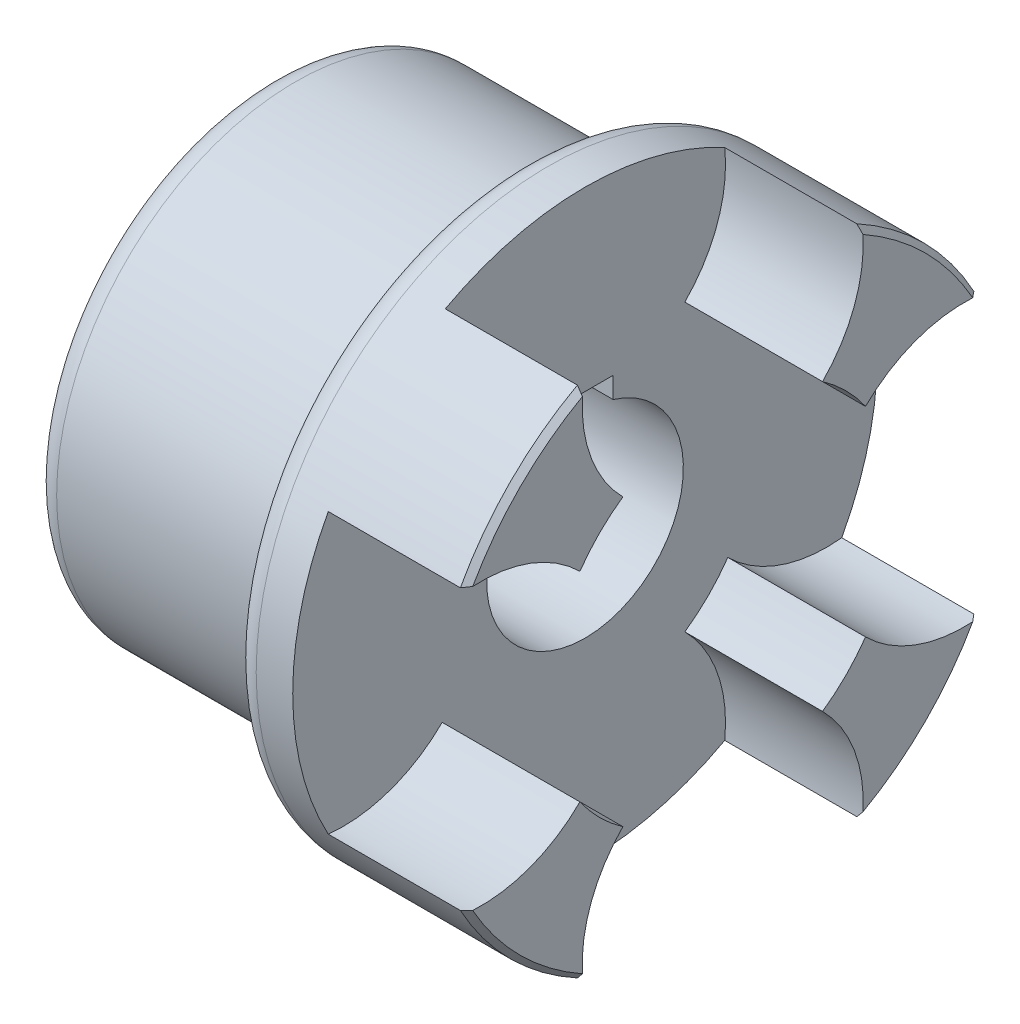
ISO-10303-21;
HEADER;
FILE_DESCRIPTION(('STEP AP214'),'2;1');
FILE_NAME('part.step','',(''),(''),'','','');
FILE_SCHEMA(('AUTOMOTIVE_DESIGN { 1 0 10303 214 1 1 1 1 }'));
ENDSEC;
DATA;
#1=APPLICATION_CONTEXT('core data for automotive mechanical design processes');
#2=APPLICATION_PROTOCOL_DEFINITION('international standard','automotive_design',2000,#1);
#3=PRODUCT_CONTEXT('',#1,'mechanical');
#4=PRODUCT('Part','Part','',(#3));
#5=PRODUCT_RELATED_PRODUCT_CATEGORY('part','',(#4));
#6=PRODUCT_DEFINITION_FORMATION('','',#4);
#7=PRODUCT_DEFINITION_CONTEXT('part definition',#1,'design');
#8=PRODUCT_DEFINITION('design','',#6,#7);
#9=PRODUCT_DEFINITION_SHAPE('','',#8);
#10=(LENGTH_UNIT() NAMED_UNIT(*) SI_UNIT(.MILLI.,.METRE.));
#11=(NAMED_UNIT(*) PLANE_ANGLE_UNIT() SI_UNIT($,.RADIAN.));
#12=(NAMED_UNIT(*) SI_UNIT($,.STERADIAN.) SOLID_ANGLE_UNIT());
#13=UNCERTAINTY_MEASURE_WITH_UNIT(LENGTH_MEASURE(1.E-05),#10,'distance_accuracy_value','');
#14=(GEOMETRIC_REPRESENTATION_CONTEXT(3) GLOBAL_UNCERTAINTY_ASSIGNED_CONTEXT((#13)) GLOBAL_UNIT_ASSIGNED_CONTEXT((#10,
#11,#12)) REPRESENTATION_CONTEXT('',''));
#15=CARTESIAN_POINT('',(0.,0.,0.));
#16=DIRECTION('',(0.,0.,1.));
#17=DIRECTION('',(1.,0.,0.));
#18=AXIS2_PLACEMENT_3D('',#15,#16,#17);
#19=CARTESIAN_POINT('',(-70.2450877192982,-25.1421929824561,0.));
#20=DIRECTION('',(-1.,0.,0.));
#21=DIRECTION('',(0.,0.,1.));
#22=AXIS2_PLACEMENT_3D('',#19,#20,#21);
#23=CYLINDRICAL_SURFACE('',#22,17.5);
#24=CARTESIAN_POINT('',(-14.2450877192987,-25.1421929824561,0.));
#25=DIRECTION('',(1.,0.,0.));
#26=DIRECTION('',(0.,0.,-1.));
#27=AXIS2_PLACEMENT_3D('',#24,#25,#26);
#28=CIRCLE('',#27,17.5);
#29=CARTESIAN_POINT('',(-14.2450877192987,-8.37168315120772,-5.));
#30=VERTEX_POINT('',#29);
#31=CARTESIAN_POINT('',(-14.2450877192987,-8.37168315120772,5.));
#32=VERTEX_POINT('',#31);
#33=EDGE_CURVE('E320',#30,#32,#28,.F.);
#34=ORIENTED_EDGE('',*,*,#33,.F.);
#35=DIRECTION('',(-1.,0.,0.));
#36=VECTOR('',#35,1.);
#37=CARTESIAN_POINT('',(-70.2450877192982,-8.37168315120772,-5.));
#38=LINE('',#37,#36);
#39=CARTESIAN_POINT('',(-69.2450877192982,-8.37168315120772,-5.));
#40=VERTEX_POINT('',#39);
#41=EDGE_CURVE('E264',#30,#40,#38,.T.);
#42=ORIENTED_EDGE('',*,*,#41,.T.);
#43=CARTESIAN_POINT('',(-69.2450877192982,-25.1421929824561,0.));
#44=DIRECTION('',(-1.,0.,0.));
#45=DIRECTION('',(0.,0.,1.));
#46=AXIS2_PLACEMENT_3D('',#43,#44,#45);
#47=CIRCLE('',#46,17.5);
#48=CARTESIAN_POINT('',(-69.2450877192982,-8.37168315120772,5.));
#49=VERTEX_POINT('',#48);
#50=EDGE_CURVE('E550',#40,#49,#47,.T.);
#51=ORIENTED_EDGE('',*,*,#50,.T.);
#52=DIRECTION('',(-1.,0.,0.));
#53=VECTOR('',#52,1.);
#54=CARTESIAN_POINT('',(-70.2450877192982,-8.37168315120772,5.));
#55=LINE('',#54,#53);
#56=EDGE_CURVE('E239',#49,#32,#55,.F.);
#57=ORIENTED_EDGE('',*,*,#56,.T.);
#58=EDGE_LOOP('',(#34,#42,#51,#57));
#59=FACE_BOUND('',#58,.T.);
#60=ADVANCED_FACE('F35',(#59),#23,.F.);
#61=CARTESIAN_POINT('',(10.2549122807013,-6.64219298245614,0.));
#62=DIRECTION('',(-1.,0.,0.));
#63=DIRECTION('',(0.,0.,1.));
#64=AXIS2_PLACEMENT_3D('',#61,#62,#63);
#65=PLANE('',#64);
#66=CARTESIAN_POINT('',(10.2549122807008,-25.1421929824561,0.));
#67=DIRECTION('',(-1.,0.,0.));
#68=DIRECTION('',(0.,0.,1.));
#69=AXIS2_PLACEMENT_3D('',#66,#67,#68);
#70=CIRCLE('',#69,51.);
#71=CARTESIAN_POINT('',(10.2549122807013,19.3345512035898,-24.9563464194777));
#72=VERTEX_POINT('',#71);
#73=CARTESIAN_POINT('',(10.2549122807013,-0.185846562978393,-44.476744186046));
#74=VERTEX_POINT('',#73);
#75=EDGE_CURVE('E551',#72,#74,#70,.T.);
#76=ORIENTED_EDGE('',*,*,#75,.F.);
#77=CARTESIAN_POINT('',(10.2549122807013,17.8578070175439,0.));
#78=DIRECTION('',(1.,0.,0.));
#79=DIRECTION('',(0.,0.,-1.));
#80=AXIS2_PLACEMENT_3D('',#77,#78,#79);
#81=CIRCLE('',#80,25.);
#82=CARTESIAN_POINT('',(10.2549122807013,0.264783761729892,-17.7619124173156));
#83=VERTEX_POINT('',#82);
#84=EDGE_CURVE('E272',#83,#72,#81,.T.);
#85=ORIENTED_EDGE('',*,*,#84,.F.);
#86=CARTESIAN_POINT('',(10.2549122807013,-25.1421929824561,0.));
#87=DIRECTION('',(1.,0.,0.));
#88=DIRECTION('',(0.,0.,-1.));
#89=AXIS2_PLACEMENT_3D('',#86,#87,#88);
#90=CIRCLE('',#89,31.);
#91=CARTESIAN_POINT('',(10.2549122807013,-7.38028056514056,-25.406976744186));
#92=VERTEX_POINT('',#91);
#93=EDGE_CURVE('E312',#92,#83,#90,.T.);
#94=ORIENTED_EDGE('',*,*,#93,.F.);
#95=CARTESIAN_POINT('',(10.2549122807013,-25.1421929824561,-43.));
#96=DIRECTION('',(1.,0.,0.));
#97=DIRECTION('',(0.,0.,-1.));
#98=AXIS2_PLACEMENT_3D('',#95,#96,#97);
#99=CIRCLE('',#98,25.);
#100=EDGE_CURVE('E309',#74,#92,#99,.T.);
#101=ORIENTED_EDGE('',*,*,#100,.F.);
#102=EDGE_LOOP('',(#76,#85,#94,#101));
#103=FACE_BOUND('',#102,.T.);
#104=ADVANCED_FACE('F389',(#103),#65,.F.);
#105=CARTESIAN_POINT('',(10.2549122807013,-50.0985394019339,-44.476744186046));
#106=VERTEX_POINT('',#105);
#107=CARTESIAN_POINT('',(10.2549122807013,-69.6189371685021,-24.9563464194777));
#108=VERTEX_POINT('',#107);
#109=EDGE_CURVE('E594',#106,#108,#70,.T.);
#110=ORIENTED_EDGE('',*,*,#109,.F.);
#111=CARTESIAN_POINT('',(10.2549122807013,-42.9041053997717,-25.406976744186));
#112=VERTEX_POINT('',#111);
#113=EDGE_CURVE('E310',#112,#106,#99,.T.);
#114=ORIENTED_EDGE('',*,*,#113,.F.);
#115=CARTESIAN_POINT('',(10.2549122807013,-25.1421929824561,0.));
#116=DIRECTION('',(1.,0.,0.));
#117=DIRECTION('',(0.,0.,-1.));
#118=AXIS2_PLACEMENT_3D('',#115,#116,#117);
#119=CIRCLE('',#118,31.);
#120=CARTESIAN_POINT('',(10.2549122807013,-50.5491697266422,-17.7619124173156));
#121=VERTEX_POINT('',#120);
#122=EDGE_CURVE('E306',#121,#112,#119,.T.);
#123=ORIENTED_EDGE('',*,*,#122,.F.);
#124=CARTESIAN_POINT('',(10.2549122807013,-68.1421929824561,0.));
#125=DIRECTION('',(1.,0.,0.));
#126=DIRECTION('',(0.,0.,-1.));
#127=AXIS2_PLACEMENT_3D('',#124,#125,#126);
#128=CIRCLE('',#127,25.);
#129=EDGE_CURVE('E303',#108,#121,#128,.T.);
#130=ORIENTED_EDGE('',*,*,#129,.F.);
#131=EDGE_LOOP('',(#110,#114,#123,#130));
#132=FACE_BOUND('',#131,.T.);
#133=ADVANCED_FACE('F396',(#132),#65,.F.);
#134=CARTESIAN_POINT('',(10.2549122807013,-25.1421929824561,0.));
#135=DIRECTION('',(1.,0.,0.));
#136=DIRECTION('',(0.,0.,-1.));
#137=AXIS2_PLACEMENT_3D('',#134,#135,#136);
#138=CIRCLE('',#137,31.);
#139=CARTESIAN_POINT('',(10.2549122807013,0.264783761729916,17.7619124173156));
#140=VERTEX_POINT('',#139);
#141=CARTESIAN_POINT('',(10.2549122807013,-7.38028056514056,25.406976744186));
#142=VERTEX_POINT('',#141);
#143=EDGE_CURVE('E267',#140,#142,#138,.T.);
#144=ORIENTED_EDGE('',*,*,#143,.F.);
#145=CARTESIAN_POINT('',(10.2549122807013,19.3345512035898,24.9563464194777));
#146=VERTEX_POINT('',#145);
#147=EDGE_CURVE('E315',#146,#140,#81,.T.);
#148=ORIENTED_EDGE('',*,*,#147,.F.);
#149=CARTESIAN_POINT('',(10.2549122807013,-0.185846562978396,44.476744186046));
#150=VERTEX_POINT('',#149);
#151=EDGE_CURVE('E548',#150,#146,#70,.T.);
#152=ORIENTED_EDGE('',*,*,#151,.F.);
#153=CARTESIAN_POINT('',(10.2549122807013,-25.1421929824561,43.));
#154=DIRECTION('',(1.,0.,0.));
#155=DIRECTION('',(0.,0.,-1.));
#156=AXIS2_PLACEMENT_3D('',#153,#154,#155);
#157=CIRCLE('',#156,25.);
#158=EDGE_CURVE('E298',#142,#150,#157,.T.);
#159=ORIENTED_EDGE('',*,*,#158,.F.);
#160=EDGE_LOOP('',(#144,#148,#152,#159));
#161=FACE_BOUND('',#160,.T.);
#162=ADVANCED_FACE('F401',(#161),#65,.F.);
#163=CARTESIAN_POINT('',(10.2549122807008,-25.1421929824561,0.));
#164=DIRECTION('',(-1.,0.,0.));
#165=DIRECTION('',(0.,0.,1.));
#166=AXIS2_PLACEMENT_3D('',#163,#164,#165);
#167=CONICAL_SURFACE('',#166,51.,0.785398163397434);
#168=ORIENTED_EDGE('',*,*,#151,.T.);
#169=CARTESIAN_POINT('',(10.2551122807008,19.3343139947532,24.9563604547268));
#170=CARTESIAN_POINT('',(10.0872245951601,19.5334492690294,24.9446013152887));
#171=CARTESIAN_POINT('',(9.91991408817931,19.7328630272279,24.9304010456661));
#172=CARTESIAN_POINT('',(9.58644742144414,20.1322475233189,24.8971182450645));
#173=CARTESIAN_POINT('',(9.42029126175822,20.3322182612444,24.8780357137958));
#174=CARTESIAN_POINT('',(9.2547122807008,20.5324674831253,24.856512052053));
#175=B_SPLINE_CURVE_WITH_KNOTS('',3,(#169,#170,#171,#172,#173,#174),.UNSPECIFIED.,.F.,.F.,(4,2,
4),(0.,0.782075893543148,1.56415183349337),.UNSPECIFIED.);
#176=CARTESIAN_POINT('',(9.2549122807008,20.532225622195,24.8565380760696));
#177=VERTEX_POINT('',#176);
#178=EDGE_CURVE('E429',#146,#177,#175,.T.);
#179=ORIENTED_EDGE('',*,*,#178,.T.);
#180=CARTESIAN_POINT('',(9.2549122807008,-25.1421929824561,0.));
#181=DIRECTION('',(-1.,0.,0.));
#182=DIRECTION('',(0.,0.,1.));
#183=AXIS2_PLACEMENT_3D('',#180,#181,#182);
#184=CIRCLE('',#183,52.);
#185=CARTESIAN_POINT('',(9.2549122807008,-0.285654906386584,45.6744186046512));
#186=VERTEX_POINT('',#185);
#187=EDGE_CURVE('E542',#186,#177,#184,.T.);
#188=ORIENTED_EDGE('',*,*,#187,.F.);
#189=CARTESIAN_POINT('',(9.2547122807008,-0.285680930403145,45.6746604655814));
#190=CARTESIAN_POINT('',(9.42029126175821,-0.264157268660323,45.4744112437006));
#191=CARTESIAN_POINT('',(9.58644742144413,-0.245074737391652,45.274440505775));
#192=CARTESIAN_POINT('',(9.91991408817931,-0.211791936790087,44.8750560096841));
#193=CARTESIAN_POINT('',(10.0872245951601,-0.197591667167487,44.6756422514855));
#194=CARTESIAN_POINT('',(10.2551122807008,-0.185832527729333,44.4765069772093));
#195=B_SPLINE_CURVE_WITH_KNOTS('',3,(#189,#190,#191,#192,#193,#194),.UNSPECIFIED.,.F.,.F.,(4,2,
4),(0.,0.782075939950221,1.56415183349337),.UNSPECIFIED.);
#196=EDGE_CURVE('E348',#186,#150,#195,.T.);
#197=ORIENTED_EDGE('',*,*,#196,.T.);
#198=EDGE_LOOP('',(#168,#179,#188,#197));
#199=FACE_BOUND('',#198,.T.);
#200=ADVANCED_FACE('F384',(#199),#167,.T.);
#201=CARTESIAN_POINT('',(9.2549122807008,20.532225622195,-24.8565380760696));
#202=VERTEX_POINT('',#201);
#203=CARTESIAN_POINT('',(9.2549122807008,-0.285654906386573,-45.6744186046512));
#204=VERTEX_POINT('',#203);
#205=EDGE_CURVE('E537',#202,#204,#184,.T.);
#206=ORIENTED_EDGE('',*,*,#205,.F.);
#207=CARTESIAN_POINT('',(9.2547122807008,20.5324674831253,-24.856512052053));
#208=CARTESIAN_POINT('',(9.42029126175822,20.3322182612444,-24.8780357137958));
#209=CARTESIAN_POINT('',(9.58644742144414,20.1322475233189,-24.8971182450645));
#210=CARTESIAN_POINT('',(9.91991408817931,19.7328630272279,-24.9304010456661));
#211=CARTESIAN_POINT('',(10.0872245951601,19.5334492690294,-24.9446013152887));
#212=CARTESIAN_POINT('',(10.2551122807008,19.3343139947532,-24.9563604547268));
#213=B_SPLINE_CURVE_WITH_KNOTS('',3,(#207,#208,#209,#210,#211,#212),.UNSPECIFIED.,.F.,.F.,(4,2,
4),(0.,0.782075939950222,1.56415183349337),.UNSPECIFIED.);
#214=EDGE_CURVE('E433',#202,#72,#213,.T.);
#215=ORIENTED_EDGE('',*,*,#214,.T.);
#216=ORIENTED_EDGE('',*,*,#75,.T.);
#217=CARTESIAN_POINT('',(10.2551122807008,-0.185832527729321,-44.4765069772093));
#218=CARTESIAN_POINT('',(10.0872245951601,-0.197591667167478,-44.6756422514855));
#219=CARTESIAN_POINT('',(9.91991408817931,-0.211791936790079,-44.8750560096841));
#220=CARTESIAN_POINT('',(9.58644742144414,-0.245074737391645,-45.274440505775));
#221=CARTESIAN_POINT('',(9.42029126175822,-0.264157268660314,-45.4744112437006));
#222=CARTESIAN_POINT('',(9.2547122807008,-0.285680930403134,-45.6746604655814));
#223=B_SPLINE_CURVE_WITH_KNOTS('',3,(#217,#218,#219,#220,#221,#222),.UNSPECIFIED.,.F.,.F.,(4,2,
4),(0.,0.782075893543145,1.56415183349337),.UNSPECIFIED.);
#224=EDGE_CURVE('E440',#74,#204,#223,.T.);
#225=ORIENTED_EDGE('',*,*,#224,.T.);
#226=EDGE_LOOP('',(#206,#215,#216,#225));
#227=FACE_BOUND('',#226,.T.);
#228=ADVANCED_FACE('F414',(#227),#167,.T.);
#229=CARTESIAN_POINT('',(9.2549122807008,-49.9987310585257,-45.6744186046512));
#230=VERTEX_POINT('',#229);
#231=CARTESIAN_POINT('',(9.2549122807008,-70.8166115871073,-24.8565380760696));
#232=VERTEX_POINT('',#231);
#233=EDGE_CURVE('E543',#230,#232,#184,.T.);
#234=ORIENTED_EDGE('',*,*,#233,.F.);
#235=CARTESIAN_POINT('',(9.2547122807008,-49.9987050345091,-45.6746604655814));
#236=CARTESIAN_POINT('',(9.42029126175822,-50.020228696252,-45.4744112437006));
#237=CARTESIAN_POINT('',(9.58644742144414,-50.0393112275206,-45.274440505775));
#238=CARTESIAN_POINT('',(9.91991408817931,-50.0725940281222,-44.8750560096841));
#239=CARTESIAN_POINT('',(10.0872245951601,-50.0867942977448,-44.6756422514855));
#240=CARTESIAN_POINT('',(10.2551122807008,-50.098553437183,-44.4765069772093));
#241=B_SPLINE_CURVE_WITH_KNOTS('',3,(#235,#236,#237,#238,#239,#240),.UNSPECIFIED.,.F.,.F.,(4,2,
4),(0.,0.782075939950226,1.56415183349337),.UNSPECIFIED.);
#242=EDGE_CURVE('E434',#230,#106,#241,.T.);
#243=ORIENTED_EDGE('',*,*,#242,.T.);
#244=ORIENTED_EDGE('',*,*,#109,.T.);
#245=CARTESIAN_POINT('',(10.2551122807008,-69.6186999596654,-24.9563604547268));
#246=CARTESIAN_POINT('',(10.0872245951601,-69.8178352339417,-24.9446013152887));
#247=CARTESIAN_POINT('',(9.91991408817931,-70.0172489921402,-24.9304010456661));
#248=CARTESIAN_POINT('',(9.58644742144414,-70.4166334882312,-24.8971182450645));
#249=CARTESIAN_POINT('',(9.42029126175822,-70.6166042261567,-24.8780357137958));
#250=CARTESIAN_POINT('',(9.2547122807008,-70.8168534480375,-24.856512052053));
#251=B_SPLINE_CURVE_WITH_KNOTS('',3,(#245,#246,#247,#248,#249,#250),.UNSPECIFIED.,.F.,.F.,(4,2,
4),(0.,0.782075893543153,1.56415183349337),.UNSPECIFIED.);
#252=EDGE_CURVE('E482',#108,#232,#251,.T.);
#253=ORIENTED_EDGE('',*,*,#252,.T.);
#254=EDGE_LOOP('',(#234,#243,#244,#253));
#255=FACE_BOUND('',#254,.T.);
#256=ADVANCED_FACE('F385',(#255),#167,.T.);
#257=CARTESIAN_POINT('',(-20.7450877192982,-25.1421929824561,0.));
#258=DIRECTION('',(-1.,0.,0.));
#259=DIRECTION('',(0.,0.,1.));
#260=AXIS2_PLACEMENT_3D('',#257,#258,#259);
#261=TOROIDAL_SURFACE('',#260,47.5,4.5);
#262=CARTESIAN_POINT('',(-25.2450877192982,-25.1421929824561,0.));
#263=DIRECTION('',(-1.,0.,0.));
#264=DIRECTION('',(0.,0.,1.));
#265=AXIS2_PLACEMENT_3D('',#262,#263,#264);
#266=CIRCLE('',#265,47.5);
#267=CARTESIAN_POINT('',(-25.2450877192982,-25.1421929824561,47.5));
#268=VERTEX_POINT('',#267);
#269=EDGE_CURVE('E522',#268,#268,#266,.T.);
#270=ORIENTED_EDGE('',*,*,#269,.F.);
#271=EDGE_LOOP('',(#270));
#272=FACE_BOUND('',#271,.T.);
#273=CARTESIAN_POINT('',(-20.7450877192982,-25.1421929824561,0.));
#274=DIRECTION('',(-1.,0.,0.));
#275=DIRECTION('',(0.,0.,1.));
#276=AXIS2_PLACEMENT_3D('',#273,#274,#275);
#277=CIRCLE('',#276,52.);
#278=CARTESIAN_POINT('',(-20.7450877192982,-25.1421929824561,52.));
#279=VERTEX_POINT('',#278);
#280=EDGE_CURVE('E437',#279,#279,#277,.T.);
#281=ORIENTED_EDGE('',*,*,#280,.T.);
#282=EDGE_LOOP('',(#281));
#283=FACE_BOUND('',#282,.T.);
#284=ADVANCED_FACE('F37',(#272,#283),#261,.T.);
#285=CARTESIAN_POINT('',(-25.2450877192982,21.8578070175439,0.));
#286=DIRECTION('',(1.,0.,0.));
#287=DIRECTION('',(0.,0.,-1.));
#288=AXIS2_PLACEMENT_3D('',#285,#286,#287);
#289=PLANE('',#288);
#290=CARTESIAN_POINT('',(-25.2450877192982,-25.1421929824561,0.));
#291=DIRECTION('',(-1.,0.,0.));
#292=DIRECTION('',(0.,0.,1.));
#293=AXIS2_PLACEMENT_3D('',#290,#291,#292);
#294=CIRCLE('',#293,47.);
#295=CARTESIAN_POINT('',(-25.2450877192982,-25.1421929824561,47.));
#296=VERTEX_POINT('',#295);
#297=EDGE_CURVE('E564',#296,#296,#294,.T.);
#298=ORIENTED_EDGE('',*,*,#297,.F.);
#299=EDGE_LOOP('',(#298));
#300=FACE_BOUND('',#299,.T.);
#301=ORIENTED_EDGE('',*,*,#269,.T.);
#302=EDGE_LOOP('',(#301));
#303=FACE_BOUND('',#302,.T.);
#304=ADVANCED_FACE('F569',(#300,#303),#289,.F.);
#305=CARTESIAN_POINT('',(-29.7450877192982,-25.1421929824561,0.));
#306=DIRECTION('',(-1.,0.,0.));
#307=DIRECTION('',(0.,0.,1.));
#308=AXIS2_PLACEMENT_3D('',#305,#306,#307);
#309=TOROIDAL_SURFACE('',#308,47.,4.5);
#310=CARTESIAN_POINT('',(-29.7450877192983,-25.1421929824561,0.));
#311=DIRECTION('',(-1.,0.,0.));
#312=DIRECTION('',(0.,0.,1.));
#313=AXIS2_PLACEMENT_3D('',#310,#311,#312);
#314=CIRCLE('',#313,42.5);
#315=CARTESIAN_POINT('',(-29.7450877192983,-25.1421929824561,42.5));
#316=VERTEX_POINT('',#315);
#317=EDGE_CURVE('E561',#316,#316,#314,.T.);
#318=ORIENTED_EDGE('',*,*,#317,.F.);
#319=EDGE_LOOP('',(#318));
#320=FACE_BOUND('',#319,.T.);
#321=ORIENTED_EDGE('',*,*,#297,.T.);
#322=EDGE_LOOP('',(#321));
#323=FACE_BOUND('',#322,.T.);
#324=ADVANCED_FACE('F655',(#320,#323),#309,.F.);
#325=CARTESIAN_POINT('',(-70.2450877192982,-25.1421929824561,0.));
#326=DIRECTION('',(-1.,0.,0.));
#327=DIRECTION('',(0.,0.,1.));
#328=AXIS2_PLACEMENT_3D('',#325,#326,#327);
#329=CYLINDRICAL_SURFACE('',#328,42.5);
#330=CARTESIAN_POINT('',(-65.7450877192982,-25.1421929824561,0.));
#331=DIRECTION('',(-1.,0.,0.));
#332=DIRECTION('',(0.,0.,1.));
#333=AXIS2_PLACEMENT_3D('',#330,#331,#332);
#334=CIRCLE('',#333,42.5);
#335=CARTESIAN_POINT('',(-65.7450877192982,-25.1421929824561,42.5));
#336=VERTEX_POINT('',#335);
#337=EDGE_CURVE('E558',#336,#336,#334,.T.);
#338=ORIENTED_EDGE('',*,*,#337,.F.);
#339=EDGE_LOOP('',(#338));
#340=FACE_BOUND('',#339,.T.);
#341=ORIENTED_EDGE('',*,*,#317,.T.);
#342=EDGE_LOOP('',(#341));
#343=FACE_BOUND('',#342,.T.);
#344=ADVANCED_FACE('F643',(#340,#343),#329,.T.);
#345=CARTESIAN_POINT('',(-65.7450877192982,-25.1421929824561,0.));
#346=DIRECTION('',(-1.,0.,0.));
#347=DIRECTION('',(0.,0.,1.));
#348=AXIS2_PLACEMENT_3D('',#345,#346,#347);
#349=TOROIDAL_SURFACE('',#348,38.,4.5);
#350=CARTESIAN_POINT('',(-70.2450877192982,-25.1421929824561,0.));
#351=DIRECTION('',(-1.,0.,0.));
#352=DIRECTION('',(0.,0.,1.));
#353=AXIS2_PLACEMENT_3D('',#350,#351,#352);
#354=CIRCLE('',#353,38.);
#355=CARTESIAN_POINT('',(-70.2450877192982,-25.1421929824561,38.));
#356=VERTEX_POINT('',#355);
#357=EDGE_CURVE('E555',#356,#356,#354,.T.);
#358=ORIENTED_EDGE('',*,*,#357,.F.);
#359=EDGE_LOOP('',(#358));
#360=FACE_BOUND('',#359,.T.);
#361=ORIENTED_EDGE('',*,*,#337,.T.);
#362=EDGE_LOOP('',(#361));
#363=FACE_BOUND('',#362,.T.);
#364=ADVANCED_FACE('F638',(#360,#363),#349,.T.);
#365=CARTESIAN_POINT('',(-70.2450877192982,-6.64219298245614,0.));
#366=DIRECTION('',(1.,0.,0.));
#367=DIRECTION('',(0.,0.,-1.));
#368=AXIS2_PLACEMENT_3D('',#365,#366,#367);
#369=PLANE('',#368);
#370=CARTESIAN_POINT('',(-70.2450877192982,-25.1421929824561,0.));
#371=DIRECTION('',(-1.,0.,0.));
#372=DIRECTION('',(0.,0.,1.));
#373=AXIS2_PLACEMENT_3D('',#370,#371,#372);
#374=CIRCLE('',#373,18.5);
#375=CARTESIAN_POINT('',(-70.2450877192982,-7.33067985189927,-5.));
#376=VERTEX_POINT('',#375);
#377=CARTESIAN_POINT('',(-70.2450877192982,-7.33067985189927,5.));
#378=VERTEX_POINT('',#377);
#379=EDGE_CURVE('E221',#376,#378,#374,.T.);
#380=ORIENTED_EDGE('',*,*,#379,.F.);
#381=DIRECTION('',(0.,1.,0.));
#382=VECTOR('',#381,1.);
#383=CARTESIAN_POINT('',(-70.2450877192982,-11.6964872147689,-5.));
#384=LINE('',#383,#382);
#385=CARTESIAN_POINT('',(-70.2450877192982,-4.64219298245614,-5.));
#386=VERTEX_POINT('',#385);
#387=EDGE_CURVE('E203',#376,#386,#384,.T.);
#388=ORIENTED_EDGE('',*,*,#387,.T.);
#389=DIRECTION('',(0.,0.,1.));
#390=VECTOR('',#389,1.);
#391=CARTESIAN_POINT('',(-70.2450877192982,-4.64219298245614,5.));
#392=LINE('',#391,#390);
#393=CARTESIAN_POINT('',(-70.2450877192982,-4.64219298245614,5.));
#394=VERTEX_POINT('',#393);
#395=EDGE_CURVE('E211',#386,#394,#392,.T.);
#396=ORIENTED_EDGE('',*,*,#395,.T.);
#397=DIRECTION('',(0.,-1.,0.));
#398=VECTOR('',#397,1.);
#399=CARTESIAN_POINT('',(-70.2450877192982,-11.6964872147689,5.));
#400=LINE('',#399,#398);
#401=EDGE_CURVE('E208',#394,#378,#400,.T.);
#402=ORIENTED_EDGE('',*,*,#401,.T.);
#403=EDGE_LOOP('',(#380,#388,#396,#402));
#404=FACE_BOUND('',#403,.T.);
#405=ORIENTED_EDGE('',*,*,#357,.T.);
#406=EDGE_LOOP('',(#405));
#407=FACE_BOUND('',#406,.T.);
#408=ADVANCED_FACE('F218',(#404,#407),#369,.F.);
#409=CARTESIAN_POINT('',(-70.2450877192982,-25.1421929824561,0.));
#410=DIRECTION('',(-1.,0.,0.));
#411=DIRECTION('',(0.,0.,1.));
#412=AXIS2_PLACEMENT_3D('',#409,#410,#411);
#413=CONICAL_SURFACE('',#412,18.5,0.785398163397448);
#414=ORIENTED_EDGE('',*,*,#50,.F.);
#415=CARTESIAN_POINT('',(-62.8635266194685,-15.2114486207872,-5.));
#416=CARTESIAN_POINT('',(-63.1295118075307,-14.9137033376911,-5.));
#417=CARTESIAN_POINT('',(-63.3967874912352,-14.6171174646595,-5.));
#418=CARTESIAN_POINT('',(-63.9334677938289,-14.0258866801272,-5.));
#419=CARTESIAN_POINT('',(-64.20287237548,-13.7312417348411,-5.));
#420=CARTESIAN_POINT('',(-64.7433533301256,-13.1435202432238,-5.));
#421=CARTESIAN_POINT('',(-65.0144296132523,-12.8504436141379,-5.));
#422=CARTESIAN_POINT('',(-65.5579670043473,-12.265575220799,-5.));
#423=CARTESIAN_POINT('',(-65.8304281193032,-11.9737834630432,-5.));
#424=CARTESIAN_POINT('',(-66.6494524535216,-11.1000627071029,-5.));
#425=CARTESIAN_POINT('',(-67.1977140815626,-10.519726009455,-5.));
#426=CARTESIAN_POINT('',(-68.2974238808274,-9.36206753011559,-5.));
#427=CARTESIAN_POINT('',(-68.848872103042,-8.78474579695148,-5.));
#428=CARTESIAN_POINT('',(-69.9540444782191,-7.63240397998549,-5.));
#429=CARTESIAN_POINT('',(-70.5077683828088,-7.05738365785039,-5.));
#430=CARTESIAN_POINT('',(-71.6169731957358,-5.90904817204558,-5.));
#431=CARTESIAN_POINT('',(-72.1724540929964,-5.33573299767007,-5.));
#432=CARTESIAN_POINT('',(-73.2848265141367,-4.19036649395071,-5.));
#433=CARTESIAN_POINT('',(-73.8417181681977,-3.61831529109381,-5.));
#434=CARTESIAN_POINT('',(-74.9565894716918,-2.47527023336437,-5.));
#435=CARTESIAN_POINT('',(-75.5145691246936,-1.90427638197216,-5.));
#436=CARTESIAN_POINT('',(-76.072956170423,-1.33368224836711,-5.));
#437=B_SPLINE_CURVE_WITH_KNOTS('',3,(#415,#416,#417,#418,#419,#420,#421,#422,#423,#424,#425,
#426,#427,#428,#429,#430,#431,#432,#433,#434,#435,#436),.UNSPECIFIED.,.F.,.F.,(4,2,2,2,2,2,2,2,
2,2,4),(0.,1.19773845436553,2.39545600443294,3.59310971913862,4.79076948310857,7.18583502839662,
9.5809390053195,11.9757881722325,14.3706222711777,16.7656860548501,19.1607577080252),.UNSPECIFIED.);
#438=EDGE_CURVE('E258',#40,#376,#437,.T.);
#439=ORIENTED_EDGE('',*,*,#438,.T.);
#440=ORIENTED_EDGE('',*,*,#379,.T.);
#441=CARTESIAN_POINT('',(-76.072956170423,-1.33368224836711,5.));
#442=CARTESIAN_POINT('',(-75.5145691246936,-1.90427638197216,5.));
#443=CARTESIAN_POINT('',(-74.9565894716918,-2.47527023336437,5.));
#444=CARTESIAN_POINT('',(-73.8417181681977,-3.61831529109381,5.));
#445=CARTESIAN_POINT('',(-73.2848265141367,-4.19036649395071,5.));
#446=CARTESIAN_POINT('',(-72.1724540929964,-5.33573299767007,5.));
#447=CARTESIAN_POINT('',(-71.6169731957358,-5.90904817204557,5.));
#448=CARTESIAN_POINT('',(-70.5077683828088,-7.05738365785039,5.));
#449=CARTESIAN_POINT('',(-69.9540444782191,-7.63240397998549,5.));
#450=CARTESIAN_POINT('',(-68.848872103042,-8.78474579695148,5.));
#451=CARTESIAN_POINT('',(-68.2974238808274,-9.36206753011559,5.));
#452=CARTESIAN_POINT('',(-67.1977140815626,-10.519726009455,5.));
#453=CARTESIAN_POINT('',(-66.6494524535216,-11.1000627071029,5.));
#454=CARTESIAN_POINT('',(-65.8304281193033,-11.9737834630432,5.));
#455=CARTESIAN_POINT('',(-65.5579670043473,-12.265575220799,5.));
#456=CARTESIAN_POINT('',(-65.0144296132523,-12.8504436141379,5.));
#457=CARTESIAN_POINT('',(-64.7433533301256,-13.1435202432238,5.));
#458=CARTESIAN_POINT('',(-64.20287237548,-13.7312417348411,5.));
#459=CARTESIAN_POINT('',(-63.9334677938288,-14.0258866801272,5.));
#460=CARTESIAN_POINT('',(-63.3967874912352,-14.6171174646595,5.));
#461=CARTESIAN_POINT('',(-63.1295118075307,-14.9137033376911,5.));
#462=CARTESIAN_POINT('',(-62.8635266194685,-15.2114486207872,5.));
#463=B_SPLINE_CURVE_WITH_KNOTS('',3,(#441,#442,#443,#444,#445,#446,#447,#448,#449,#450,#451,
#452,#453,#454,#455,#456,#457,#458,#459,#460,#461,#462),.UNSPECIFIED.,.F.,.F.,(4,2,2,2,2,2,2,2,
2,2,4),(0.,2.39507165317512,4.79013543684745,7.18496953579263,9.57981870270569,11.9749226796286,
14.3699882249166,15.5676479888866,16.7653017035922,17.9630192536597,19.1607577080252),.UNSPECIFIED.);
#464=EDGE_CURVE('E229',#378,#49,#463,.T.);
#465=ORIENTED_EDGE('',*,*,#464,.T.);
#466=EDGE_LOOP('',(#414,#439,#440,#465));
#467=FACE_BOUND('',#466,.T.);
#468=ADVANCED_FACE('F241',(#467),#413,.F.);
#469=CARTESIAN_POINT('',(10.2549122807013,-69.6189371685021,24.9563464194777));
#470=VERTEX_POINT('',#469);
#471=CARTESIAN_POINT('',(10.2549122807013,-50.0985394019339,44.476744186046));
#472=VERTEX_POINT('',#471);
#473=EDGE_CURVE('E545',#470,#472,#70,.T.);
#474=ORIENTED_EDGE('',*,*,#473,.F.);
#475=CARTESIAN_POINT('',(10.2549122807013,-50.5491697266422,17.7619124173156));
#476=VERTEX_POINT('',#475);
#477=EDGE_CURVE('E304',#476,#470,#128,.T.);
#478=ORIENTED_EDGE('',*,*,#477,.F.);
#479=CARTESIAN_POINT('',(10.2549122807013,-25.1421929824561,0.));
#480=DIRECTION('',(1.,0.,0.));
#481=DIRECTION('',(0.,0.,-1.));
#482=AXIS2_PLACEMENT_3D('',#479,#480,#481);
#483=CIRCLE('',#482,31.);
#484=CARTESIAN_POINT('',(10.2549122807013,-42.9041053997717,25.406976744186));
#485=VERTEX_POINT('',#484);
#486=EDGE_CURVE('E300',#485,#476,#483,.T.);
#487=ORIENTED_EDGE('',*,*,#486,.F.);
#488=EDGE_CURVE('E297',#472,#485,#157,.T.);
#489=ORIENTED_EDGE('',*,*,#488,.F.);
#490=EDGE_LOOP('',(#474,#478,#487,#489));
#491=FACE_BOUND('',#490,.T.);
#492=ADVANCED_FACE('F382',(#491),#65,.F.);
#493=CARTESIAN_POINT('',(9.2549122807008,-70.8166115871073,24.8565380760695));
#494=VERTEX_POINT('',#493);
#495=CARTESIAN_POINT('',(9.2549122807008,-49.9987310585257,45.6744186046512));
#496=VERTEX_POINT('',#495);
#497=EDGE_CURVE('E546',#494,#496,#184,.T.);
#498=ORIENTED_EDGE('',*,*,#497,.F.);
#499=CARTESIAN_POINT('',(9.2547122807008,-70.8168534480375,24.856512052053));
#500=CARTESIAN_POINT('',(9.42029126175822,-70.6166042261567,24.8780357137958));
#501=CARTESIAN_POINT('',(9.58644742144414,-70.4166334882312,24.8971182450645));
#502=CARTESIAN_POINT('',(9.91991408817931,-70.0172489921402,24.9304010456661));
#503=CARTESIAN_POINT('',(10.0872245951601,-69.8178352339417,24.9446013152887));
#504=CARTESIAN_POINT('',(10.2551122807008,-69.6186999596654,24.9563604547268));
#505=B_SPLINE_CURVE_WITH_KNOTS('',3,(#499,#500,#501,#502,#503,#504),.UNSPECIFIED.,.F.,.F.,(4,2,
4),(0.,0.782075939950217,1.56415183349337),.UNSPECIFIED.);
#506=EDGE_CURVE('E476',#494,#470,#505,.T.);
#507=ORIENTED_EDGE('',*,*,#506,.T.);
#508=ORIENTED_EDGE('',*,*,#473,.T.);
#509=CARTESIAN_POINT('',(10.2551122807008,-50.098553437183,44.4765069772093));
#510=CARTESIAN_POINT('',(10.0872245951601,-50.0867942977448,44.6756422514855));
#511=CARTESIAN_POINT('',(9.91991408817931,-50.0725940281222,44.8750560096841));
#512=CARTESIAN_POINT('',(9.58644742144414,-50.0393112275206,45.274440505775));
#513=CARTESIAN_POINT('',(9.42029126175822,-50.020228696252,45.4744112437006));
#514=CARTESIAN_POINT('',(9.2547122807008,-49.9987050345091,45.6746604655814));
#515=B_SPLINE_CURVE_WITH_KNOTS('',3,(#509,#510,#511,#512,#513,#514),.UNSPECIFIED.,.F.,.F.,(4,2,
4),(0.,0.782075893543143,1.56415183349336),.UNSPECIFIED.);
#516=EDGE_CURVE('E339',#472,#496,#515,.T.);
#517=ORIENTED_EDGE('',*,*,#516,.T.);
#518=EDGE_LOOP('',(#498,#507,#508,#517));
#519=FACE_BOUND('',#518,.T.);
#520=ADVANCED_FACE('F354',(#519),#167,.T.);
#521=CARTESIAN_POINT('',(-70.2450877192982,-25.1421929824561,0.));
#522=DIRECTION('',(-1.,0.,0.));
#523=DIRECTION('',(0.,0.,1.));
#524=AXIS2_PLACEMENT_3D('',#521,#522,#523);
#525=CYLINDRICAL_SURFACE('',#524,52.);
#526=ORIENTED_EDGE('',*,*,#280,.F.);
#527=EDGE_LOOP('',(#526));
#528=FACE_BOUND('',#527,.T.);
#529=CARTESIAN_POINT('',(-14.2450877192987,-25.1421929824561,0.));
#530=DIRECTION('',(1.,0.,0.));
#531=DIRECTION('',(0.,0.,-1.));
#532=AXIS2_PLACEMENT_3D('',#529,#530,#531);
#533=CIRCLE('',#532,52.);
#534=CARTESIAN_POINT('',(-14.2450877192987,20.532225622195,-24.8565380760696));
#535=VERTEX_POINT('',#534);
#536=CARTESIAN_POINT('',(-14.2450877192987,20.532225622195,24.8565380760696));
#537=VERTEX_POINT('',#536);
#538=EDGE_CURVE('E523',#535,#537,#533,.T.);
#539=ORIENTED_EDGE('',*,*,#538,.F.);
#540=DIRECTION('',(1.,0.,0.));
#541=VECTOR('',#540,1.);
#542=CARTESIAN_POINT('',(-1.99508771929872,20.532225622195,-24.8565380760696));
#543=LINE('',#542,#541);
#544=EDGE_CURVE('E43',#535,#202,#543,.T.);
#545=ORIENTED_EDGE('',*,*,#544,.T.);
#546=ORIENTED_EDGE('',*,*,#205,.T.);
#547=DIRECTION('',(1.,0.,0.));
#548=VECTOR('',#547,1.);
#549=CARTESIAN_POINT('',(-1.99508771929872,-0.285654906386573,-45.6744186046512));
#550=LINE('',#549,#548);
#551=CARTESIAN_POINT('',(-14.2450877192987,-0.285654906386573,-45.6744186046512));
#552=VERTEX_POINT('',#551);
#553=EDGE_CURVE('E518',#204,#552,#550,.F.);
#554=ORIENTED_EDGE('',*,*,#553,.T.);
#555=CARTESIAN_POINT('',(-14.2450877192987,-49.9987310585257,-45.6744186046512));
#556=VERTEX_POINT('',#555);
#557=EDGE_CURVE('E515',#556,#552,#533,.T.);
#558=ORIENTED_EDGE('',*,*,#557,.F.);
#559=DIRECTION('',(1.,0.,0.));
#560=VECTOR('',#559,1.);
#561=CARTESIAN_POINT('',(-1.99508771929872,-49.9987310585257,-45.6744186046512));
#562=LINE('',#561,#560);
#563=EDGE_CURVE('E513',#556,#230,#562,.T.);
#564=ORIENTED_EDGE('',*,*,#563,.T.);
#565=ORIENTED_EDGE('',*,*,#233,.T.);
#566=DIRECTION('',(1.,0.,0.));
#567=VECTOR('',#566,1.);
#568=CARTESIAN_POINT('',(-1.99508771929872,-70.8166115871073,-24.8565380760696));
#569=LINE('',#568,#567);
#570=CARTESIAN_POINT('',(-14.2450877192987,-70.8166115871073,-24.8565380760696));
#571=VERTEX_POINT('',#570);
#572=EDGE_CURVE('E505',#232,#571,#569,.F.);
#573=ORIENTED_EDGE('',*,*,#572,.T.);
#574=CARTESIAN_POINT('',(-14.2450877192987,-70.8166115871073,24.8565380760696));
#575=VERTEX_POINT('',#574);
#576=EDGE_CURVE('E507',#575,#571,#533,.T.);
#577=ORIENTED_EDGE('',*,*,#576,.F.);
#578=DIRECTION('',(1.,0.,0.));
#579=VECTOR('',#578,1.);
#580=CARTESIAN_POINT('',(-1.99508771929872,-70.8166115871073,24.8565380760696));
#581=LINE('',#580,#579);
#582=EDGE_CURVE('E500',#575,#494,#581,.T.);
#583=ORIENTED_EDGE('',*,*,#582,.T.);
#584=ORIENTED_EDGE('',*,*,#497,.T.);
#585=DIRECTION('',(1.,0.,0.));
#586=VECTOR('',#585,1.);
#587=CARTESIAN_POINT('',(-1.99508771929872,-49.9987310585257,45.6744186046512));
#588=LINE('',#587,#586);
#589=CARTESIAN_POINT('',(-14.2450877192987,-49.9987310585257,45.6744186046512));
#590=VERTEX_POINT('',#589);
#591=EDGE_CURVE('E524',#496,#590,#588,.F.);
#592=ORIENTED_EDGE('',*,*,#591,.T.);
#593=CARTESIAN_POINT('',(-14.2450877192987,-0.285654906386584,45.6744186046512));
#594=VERTEX_POINT('',#593);
#595=EDGE_CURVE('E504',#594,#590,#533,.T.);
#596=ORIENTED_EDGE('',*,*,#595,.F.);
#597=DIRECTION('',(1.,0.,0.));
#598=VECTOR('',#597,1.);
#599=CARTESIAN_POINT('',(-1.99508771929872,-0.28565490638658,45.6744186046512));
#600=LINE('',#599,#598);
#601=EDGE_CURVE('E528',#594,#186,#600,.T.);
#602=ORIENTED_EDGE('',*,*,#601,.T.);
#603=ORIENTED_EDGE('',*,*,#187,.T.);
#604=DIRECTION('',(1.,0.,0.));
#605=VECTOR('',#604,1.);
#606=CARTESIAN_POINT('',(-1.99508771929872,20.532225622195,24.8565380760696));
#607=LINE('',#606,#605);
#608=EDGE_CURVE('E430',#177,#537,#607,.F.);
#609=ORIENTED_EDGE('',*,*,#608,.T.);
#610=EDGE_LOOP('',(#539,#545,#546,#554,#558,#564,#565,#573,#577,#583,#584,#592,#596,#602,#603,#609));
#611=FACE_BOUND('',#610,.T.);
#612=ADVANCED_FACE('F372',(#528,#611),#525,.T.);
#613=CARTESIAN_POINT('',(-14.2450877192987,17.8578070175439,0.));
#614=DIRECTION('',(1.,0.,0.));
#615=DIRECTION('',(0.,0.,-1.));
#616=AXIS2_PLACEMENT_3D('',#613,#614,#615);
#617=CYLINDRICAL_SURFACE('',#616,25.);
#618=ORIENTED_EDGE('',*,*,#544,.F.);
#619=CARTESIAN_POINT('',(-14.2450877192987,17.8578070175439,0.));
#620=DIRECTION('',(1.,0.,0.));
#621=DIRECTION('',(0.,0.,-1.));
#622=AXIS2_PLACEMENT_3D('',#619,#620,#621);
#623=CIRCLE('',#622,25.);
#624=CARTESIAN_POINT('',(-14.2450877192987,0.264783761729892,-17.7619124173156));
#625=VERTEX_POINT('',#624);
#626=EDGE_CURVE('E291',#625,#535,#623,.T.);
#627=ORIENTED_EDGE('',*,*,#626,.F.);
#628=DIRECTION('',(1.,0.,0.));
#629=VECTOR('',#628,1.);
#630=CARTESIAN_POINT('',(-14.2450877192987,0.264783761729892,-17.7619124173156));
#631=LINE('',#630,#629);
#632=EDGE_CURVE('E321',#625,#83,#631,.T.);
#633=ORIENTED_EDGE('',*,*,#632,.T.);
#634=ORIENTED_EDGE('',*,*,#84,.T.);
#635=ORIENTED_EDGE('',*,*,#214,.F.);
#636=EDGE_LOOP('',(#618,#627,#633,#634,#635));
#637=FACE_BOUND('',#636,.T.);
#638=ADVANCED_FACE('F374',(#637),#617,.F.);
#639=ORIENTED_EDGE('',*,*,#147,.T.);
#640=DIRECTION('',(1.,0.,0.));
#641=VECTOR('',#640,1.);
#642=CARTESIAN_POINT('',(-14.2450877192987,0.264783761729916,17.7619124173156));
#643=LINE('',#642,#641);
#644=CARTESIAN_POINT('',(-14.2450877192987,0.264783761729916,17.7619124173156));
#645=VERTEX_POINT('',#644);
#646=EDGE_CURVE('E317',#645,#140,#643,.T.);
#647=ORIENTED_EDGE('',*,*,#646,.F.);
#648=EDGE_CURVE('E290',#537,#645,#623,.T.);
#649=ORIENTED_EDGE('',*,*,#648,.F.);
#650=ORIENTED_EDGE('',*,*,#608,.F.);
#651=ORIENTED_EDGE('',*,*,#178,.F.);
#652=EDGE_LOOP('',(#639,#647,#649,#650,#651));
#653=FACE_BOUND('',#652,.T.);
#654=ADVANCED_FACE('F380',(#653),#617,.F.);
#655=CARTESIAN_POINT('',(-14.2450877192987,-25.1421929824561,-43.));
#656=DIRECTION('',(1.,0.,0.));
#657=DIRECTION('',(0.,0.,-1.));
#658=AXIS2_PLACEMENT_3D('',#655,#656,#657);
#659=CYLINDRICAL_SURFACE('',#658,25.);
#660=ORIENTED_EDGE('',*,*,#563,.F.);
#661=CARTESIAN_POINT('',(-14.2450877192987,-25.1421929824561,-43.));
#662=DIRECTION('',(1.,0.,0.));
#663=DIRECTION('',(0.,0.,-1.));
#664=AXIS2_PLACEMENT_3D('',#661,#662,#663);
#665=CIRCLE('',#664,25.);
#666=CARTESIAN_POINT('',(-14.2450877192987,-42.9041053997717,-25.406976744186));
#667=VERTEX_POINT('',#666);
#668=EDGE_CURVE('E57',#667,#556,#665,.T.);
#669=ORIENTED_EDGE('',*,*,#668,.F.);
#670=DIRECTION('',(1.,0.,0.));
#671=VECTOR('',#670,1.);
#672=CARTESIAN_POINT('',(-14.2450877192987,-42.9041053997717,-25.406976744186));
#673=LINE('',#672,#671);
#674=EDGE_CURVE('E326',#667,#112,#673,.T.);
#675=ORIENTED_EDGE('',*,*,#674,.T.);
#676=ORIENTED_EDGE('',*,*,#113,.T.);
#677=ORIENTED_EDGE('',*,*,#242,.F.);
#678=EDGE_LOOP('',(#660,#669,#675,#676,#677));
#679=FACE_BOUND('',#678,.T.);
#680=ADVANCED_FACE('F463',(#679),#659,.F.);
#681=ORIENTED_EDGE('',*,*,#100,.T.);
#682=DIRECTION('',(1.,0.,0.));
#683=VECTOR('',#682,1.);
#684=CARTESIAN_POINT('',(-14.2450877192987,-7.38028056514056,-25.406976744186));
#685=LINE('',#684,#683);
#686=CARTESIAN_POINT('',(-14.2450877192987,-7.38028056514056,-25.406976744186));
#687=VERTEX_POINT('',#686);
#688=EDGE_CURVE('E323',#687,#92,#685,.T.);
#689=ORIENTED_EDGE('',*,*,#688,.F.);
#690=EDGE_CURVE('E285',#552,#687,#665,.T.);
#691=ORIENTED_EDGE('',*,*,#690,.F.);
#692=ORIENTED_EDGE('',*,*,#553,.F.);
#693=ORIENTED_EDGE('',*,*,#224,.F.);
#694=EDGE_LOOP('',(#681,#689,#691,#692,#693));
#695=FACE_BOUND('',#694,.T.);
#696=ADVANCED_FACE('F467',(#695),#659,.F.);
#697=CARTESIAN_POINT('',(-14.2450877192987,-68.1421929824561,0.));
#698=DIRECTION('',(1.,0.,0.));
#699=DIRECTION('',(0.,0.,-1.));
#700=AXIS2_PLACEMENT_3D('',#697,#698,#699);
#701=CYLINDRICAL_SURFACE('',#700,25.);
#702=ORIENTED_EDGE('',*,*,#582,.F.);
#703=CARTESIAN_POINT('',(-14.2450877192987,-68.1421929824561,0.));
#704=DIRECTION('',(1.,0.,0.));
#705=DIRECTION('',(0.,0.,-1.));
#706=AXIS2_PLACEMENT_3D('',#703,#704,#705);
#707=CIRCLE('',#706,25.);
#708=CARTESIAN_POINT('',(-14.2450877192987,-50.5491697266422,17.7619124173156));
#709=VERTEX_POINT('',#708);
#710=EDGE_CURVE('E280',#709,#575,#707,.T.);
#711=ORIENTED_EDGE('',*,*,#710,.F.);
#712=DIRECTION('',(1.,0.,0.));
#713=VECTOR('',#712,1.);
#714=CARTESIAN_POINT('',(-14.2450877192987,-50.5491697266422,17.7619124173156));
#715=LINE('',#714,#713);
#716=EDGE_CURVE('E331',#709,#476,#715,.T.);
#717=ORIENTED_EDGE('',*,*,#716,.T.);
#718=ORIENTED_EDGE('',*,*,#477,.T.);
#719=ORIENTED_EDGE('',*,*,#506,.F.);
#720=EDGE_LOOP('',(#702,#711,#717,#718,#719));
#721=FACE_BOUND('',#720,.T.);
#722=ADVANCED_FACE('F487',(#721),#701,.F.);
#723=ORIENTED_EDGE('',*,*,#129,.T.);
#724=DIRECTION('',(1.,0.,0.));
#725=VECTOR('',#724,1.);
#726=CARTESIAN_POINT('',(-14.2450877192987,-50.5491697266422,-17.7619124173156));
#727=LINE('',#726,#725);
#728=CARTESIAN_POINT('',(-14.2450877192987,-50.5491697266422,-17.7619124173156));
#729=VERTEX_POINT('',#728);
#730=EDGE_CURVE('E328',#729,#121,#727,.T.);
#731=ORIENTED_EDGE('',*,*,#730,.F.);
#732=EDGE_CURVE('E279',#571,#729,#707,.T.);
#733=ORIENTED_EDGE('',*,*,#732,.F.);
#734=ORIENTED_EDGE('',*,*,#572,.F.);
#735=ORIENTED_EDGE('',*,*,#252,.F.);
#736=EDGE_LOOP('',(#723,#731,#733,#734,#735));
#737=FACE_BOUND('',#736,.T.);
#738=ADVANCED_FACE('F364',(#737),#701,.F.);
#739=CARTESIAN_POINT('',(-14.2450877192987,-25.1421929824561,43.));
#740=DIRECTION('',(1.,0.,0.));
#741=DIRECTION('',(0.,0.,-1.));
#742=AXIS2_PLACEMENT_3D('',#739,#740,#741);
#743=CYLINDRICAL_SURFACE('',#742,25.);
#744=ORIENTED_EDGE('',*,*,#601,.F.);
#745=CARTESIAN_POINT('',(-14.2450877192987,-25.1421929824561,43.));
#746=DIRECTION('',(1.,0.,0.));
#747=DIRECTION('',(0.,0.,-1.));
#748=AXIS2_PLACEMENT_3D('',#745,#746,#747);
#749=CIRCLE('',#748,25.);
#750=CARTESIAN_POINT('',(-14.2450877192987,-7.38028056514056,25.406976744186));
#751=VERTEX_POINT('',#750);
#752=EDGE_CURVE('E273',#751,#594,#749,.T.);
#753=ORIENTED_EDGE('',*,*,#752,.F.);
#754=DIRECTION('',(1.,0.,0.));
#755=VECTOR('',#754,1.);
#756=CARTESIAN_POINT('',(-14.2450877192987,-7.38028056514056,25.406976744186));
#757=LINE('',#756,#755);
#758=EDGE_CURVE('E294',#751,#142,#757,.T.);
#759=ORIENTED_EDGE('',*,*,#758,.T.);
#760=ORIENTED_EDGE('',*,*,#158,.T.);
#761=ORIENTED_EDGE('',*,*,#196,.F.);
#762=EDGE_LOOP('',(#744,#753,#759,#760,#761));
#763=FACE_BOUND('',#762,.T.);
#764=ADVANCED_FACE('F358',(#763),#743,.F.);
#765=ORIENTED_EDGE('',*,*,#488,.T.);
#766=DIRECTION('',(1.,0.,0.));
#767=VECTOR('',#766,1.);
#768=CARTESIAN_POINT('',(-14.2450877192987,-42.9041053997717,25.406976744186));
#769=LINE('',#768,#767);
#770=CARTESIAN_POINT('',(-14.2450877192987,-42.9041053997717,25.406976744186));
#771=VERTEX_POINT('',#770);
#772=EDGE_CURVE('E333',#771,#485,#769,.T.);
#773=ORIENTED_EDGE('',*,*,#772,.F.);
#774=EDGE_CURVE('E271',#590,#771,#749,.T.);
#775=ORIENTED_EDGE('',*,*,#774,.F.);
#776=ORIENTED_EDGE('',*,*,#591,.F.);
#777=ORIENTED_EDGE('',*,*,#516,.F.);
#778=EDGE_LOOP('',(#765,#773,#775,#776,#777));
#779=FACE_BOUND('',#778,.T.);
#780=ADVANCED_FACE('F363',(#779),#743,.F.);
#781=CARTESIAN_POINT('',(-14.2450877192987,-25.1421929824561,21.5));
#782=DIRECTION('',(1.,0.,0.));
#783=DIRECTION('',(0.,0.,-1.));
#784=AXIS2_PLACEMENT_3D('',#781,#782,#783);
#785=PLANE('',#784);
#786=DIRECTION('',(0.,1.,0.));
#787=VECTOR('',#786,1.);
#788=CARTESIAN_POINT('',(-14.2450877192987,-25.1421929824561,-5.));
#789=LINE('',#788,#787);
#790=CARTESIAN_POINT('',(-14.2450877192987,-4.64219298245614,-5.));
#791=VERTEX_POINT('',#790);
#792=EDGE_CURVE('E11',#30,#791,#789,.T.);
#793=ORIENTED_EDGE('',*,*,#792,.F.);
#794=ORIENTED_EDGE('',*,*,#33,.T.);
#795=DIRECTION('',(0.,-1.,0.));
#796=VECTOR('',#795,1.);
#797=CARTESIAN_POINT('',(-14.2450877192987,-11.6964872147689,5.));
#798=LINE('',#797,#796);
#799=CARTESIAN_POINT('',(-14.2450877192987,-4.64219298245614,5.));
#800=VERTEX_POINT('',#799);
#801=EDGE_CURVE('E222',#800,#32,#798,.T.);
#802=ORIENTED_EDGE('',*,*,#801,.F.);
#803=DIRECTION('',(0.,0.,1.));
#804=VECTOR('',#803,1.);
#805=CARTESIAN_POINT('',(-14.2450877192987,-4.64219298245614,5.));
#806=LINE('',#805,#804);
#807=EDGE_CURVE('E224',#791,#800,#806,.T.);
#808=ORIENTED_EDGE('',*,*,#807,.F.);
#809=EDGE_LOOP('',(#793,#794,#802,#808));
#810=FACE_BOUND('',#809,.T.);
#811=ORIENTED_EDGE('',*,*,#538,.T.);
#812=ORIENTED_EDGE('',*,*,#648,.T.);
#813=CARTESIAN_POINT('',(-14.2450877192987,-25.1421929824561,0.));
#814=DIRECTION('',(1.,0.,0.));
#815=DIRECTION('',(0.,0.,-1.));
#816=AXIS2_PLACEMENT_3D('',#813,#814,#815);
#817=CIRCLE('',#816,31.);
#818=EDGE_CURVE('E268',#645,#751,#817,.T.);
#819=ORIENTED_EDGE('',*,*,#818,.T.);
#820=ORIENTED_EDGE('',*,*,#752,.T.);
#821=ORIENTED_EDGE('',*,*,#595,.T.);
#822=ORIENTED_EDGE('',*,*,#774,.T.);
#823=CARTESIAN_POINT('',(-14.2450877192987,-25.1421929824561,0.));
#824=DIRECTION('',(1.,0.,0.));
#825=DIRECTION('',(0.,0.,-1.));
#826=AXIS2_PLACEMENT_3D('',#823,#824,#825);
#827=CIRCLE('',#826,31.);
#828=EDGE_CURVE('E276',#771,#709,#827,.T.);
#829=ORIENTED_EDGE('',*,*,#828,.T.);
#830=ORIENTED_EDGE('',*,*,#710,.T.);
#831=ORIENTED_EDGE('',*,*,#576,.T.);
#832=ORIENTED_EDGE('',*,*,#732,.T.);
#833=CARTESIAN_POINT('',(-14.2450877192987,-25.1421929824561,0.));
#834=DIRECTION('',(1.,0.,0.));
#835=DIRECTION('',(0.,0.,-1.));
#836=AXIS2_PLACEMENT_3D('',#833,#834,#835);
#837=CIRCLE('',#836,31.);
#838=EDGE_CURVE('E283',#729,#667,#837,.T.);
#839=ORIENTED_EDGE('',*,*,#838,.T.);
#840=ORIENTED_EDGE('',*,*,#668,.T.);
#841=ORIENTED_EDGE('',*,*,#557,.T.);
#842=ORIENTED_EDGE('',*,*,#690,.T.);
#843=CARTESIAN_POINT('',(-14.2450877192987,-25.1421929824561,0.));
#844=DIRECTION('',(1.,0.,0.));
#845=DIRECTION('',(0.,0.,-1.));
#846=AXIS2_PLACEMENT_3D('',#843,#844,#845);
#847=CIRCLE('',#846,31.);
#848=EDGE_CURVE('E287',#687,#625,#847,.T.);
#849=ORIENTED_EDGE('',*,*,#848,.T.);
#850=ORIENTED_EDGE('',*,*,#626,.T.);
#851=EDGE_LOOP('',(#811,#812,#819,#820,#821,#822,#829,#830,#831,#832,#839,#840,#841,#842,#849,#850));
#852=FACE_BOUND('',#851,.T.);
#853=ADVANCED_FACE('F256',(#810,#852),#785,.T.);
#854=CARTESIAN_POINT('',(-14.2450877192987,-25.1421929824561,0.));
#855=DIRECTION('',(1.,0.,0.));
#856=DIRECTION('',(0.,0.,-1.));
#857=AXIS2_PLACEMENT_3D('',#854,#855,#856);
#858=CYLINDRICAL_SURFACE('',#857,31.);
#859=ORIENTED_EDGE('',*,*,#143,.T.);
#860=ORIENTED_EDGE('',*,*,#758,.F.);
#861=ORIENTED_EDGE('',*,*,#818,.F.);
#862=ORIENTED_EDGE('',*,*,#646,.T.);
#863=EDGE_LOOP('',(#859,#860,#861,#862));
#864=FACE_BOUND('',#863,.T.);
#865=ADVANCED_FACE('F367',(#864),#858,.F.);
#866=CARTESIAN_POINT('',(-14.2450877192987,-25.1421929824561,0.));
#867=DIRECTION('',(1.,0.,0.));
#868=DIRECTION('',(0.,0.,-1.));
#869=AXIS2_PLACEMENT_3D('',#866,#867,#868);
#870=CYLINDRICAL_SURFACE('',#869,31.);
#871=ORIENTED_EDGE('',*,*,#93,.T.);
#872=ORIENTED_EDGE('',*,*,#632,.F.);
#873=ORIENTED_EDGE('',*,*,#848,.F.);
#874=ORIENTED_EDGE('',*,*,#688,.T.);
#875=EDGE_LOOP('',(#871,#872,#873,#874));
#876=FACE_BOUND('',#875,.T.);
#877=ADVANCED_FACE('F370',(#876),#870,.F.);
#878=CARTESIAN_POINT('',(-14.2450877192987,-25.1421929824561,0.));
#879=DIRECTION('',(1.,0.,0.));
#880=DIRECTION('',(0.,0.,-1.));
#881=AXIS2_PLACEMENT_3D('',#878,#879,#880);
#882=CYLINDRICAL_SURFACE('',#881,31.);
#883=ORIENTED_EDGE('',*,*,#122,.T.);
#884=ORIENTED_EDGE('',*,*,#674,.F.);
#885=ORIENTED_EDGE('',*,*,#838,.F.);
#886=ORIENTED_EDGE('',*,*,#730,.T.);
#887=EDGE_LOOP('',(#883,#884,#885,#886));
#888=FACE_BOUND('',#887,.T.);
#889=ADVANCED_FACE('F461',(#888),#882,.F.);
#890=CARTESIAN_POINT('',(-14.2450877192987,-25.1421929824561,0.));
#891=DIRECTION('',(1.,0.,0.));
#892=DIRECTION('',(0.,0.,-1.));
#893=AXIS2_PLACEMENT_3D('',#890,#891,#892);
#894=CYLINDRICAL_SURFACE('',#893,31.);
#895=ORIENTED_EDGE('',*,*,#486,.T.);
#896=ORIENTED_EDGE('',*,*,#716,.F.);
#897=ORIENTED_EDGE('',*,*,#828,.F.);
#898=ORIENTED_EDGE('',*,*,#772,.T.);
#899=EDGE_LOOP('',(#895,#896,#897,#898));
#900=FACE_BOUND('',#899,.T.);
#901=ADVANCED_FACE('F255',(#900),#894,.F.);
#902=CARTESIAN_POINT('',(-70.2450877192982,-11.6964872147689,-5.));
#903=DIRECTION('',(0.,0.,-1.));
#904=DIRECTION('',(0.,1.,0.));
#905=AXIS2_PLACEMENT_3D('',#902,#903,#904);
#906=PLANE('',#905);
#907=ORIENTED_EDGE('',*,*,#792,.T.);
#908=DIRECTION('',(1.,0.,0.));
#909=VECTOR('',#908,1.);
#910=CARTESIAN_POINT('',(-70.2450877192982,-4.64219298245614,-5.));
#911=LINE('',#910,#909);
#912=EDGE_CURVE('E50',#386,#791,#911,.T.);
#913=ORIENTED_EDGE('',*,*,#912,.F.);
#914=ORIENTED_EDGE('',*,*,#387,.F.);
#915=ORIENTED_EDGE('',*,*,#438,.F.);
#916=ORIENTED_EDGE('',*,*,#41,.F.);
#917=EDGE_LOOP('',(#907,#913,#914,#915,#916));
#918=FACE_BOUND('',#917,.T.);
#919=ADVANCED_FACE('F201',(#918),#906,.F.);
#920=CARTESIAN_POINT('',(-70.2450877192982,-11.6964872147689,5.));
#921=DIRECTION('',(0.,0.,1.));
#922=DIRECTION('',(1.,0.,0.));
#923=AXIS2_PLACEMENT_3D('',#920,#921,#922);
#924=PLANE('',#923);
#925=ORIENTED_EDGE('',*,*,#464,.F.);
#926=ORIENTED_EDGE('',*,*,#401,.F.);
#927=DIRECTION('',(1.,0.,0.));
#928=VECTOR('',#927,1.);
#929=CARTESIAN_POINT('',(-70.2450877192982,-4.64219298245614,5.));
#930=LINE('',#929,#928);
#931=EDGE_CURVE('E207',#394,#800,#930,.T.);
#932=ORIENTED_EDGE('',*,*,#931,.T.);
#933=ORIENTED_EDGE('',*,*,#801,.T.);
#934=ORIENTED_EDGE('',*,*,#56,.F.);
#935=EDGE_LOOP('',(#925,#926,#932,#933,#934));
#936=FACE_BOUND('',#935,.T.);
#937=ADVANCED_FACE('F245',(#936),#924,.F.);
#938=CARTESIAN_POINT('',(-70.2450877192982,-4.64219298245614,5.));
#939=DIRECTION('',(0.,1.,0.));
#940=DIRECTION('',(0.,0.,1.));
#941=AXIS2_PLACEMENT_3D('',#938,#939,#940);
#942=PLANE('',#941);
#943=ORIENTED_EDGE('',*,*,#807,.T.);
#944=ORIENTED_EDGE('',*,*,#931,.F.);
#945=ORIENTED_EDGE('',*,*,#395,.F.);
#946=ORIENTED_EDGE('',*,*,#912,.T.);
#947=EDGE_LOOP('',(#943,#944,#945,#946));
#948=FACE_BOUND('',#947,.T.);
#949=ADVANCED_FACE('F212',(#948),#942,.F.);
#950=CLOSED_SHELL('',(#60,#104,#133,#162,#200,#228,#256,#284,#304,#324,#344,#364,#408,#468,#492,
#520,#612,#638,#654,#680,#696,#722,#738,#764,#780,#853,#865,#877,#889,#901,#919,#937,#949));
#951=MANIFOLD_SOLID_BREP('B2',#950);
#952=ADVANCED_BREP_SHAPE_REPRESENTATION('',(#18,#951),#14);
#953=SHAPE_DEFINITION_REPRESENTATION(#9,#952);
ENDSEC;
END-ISO-10303-21;
